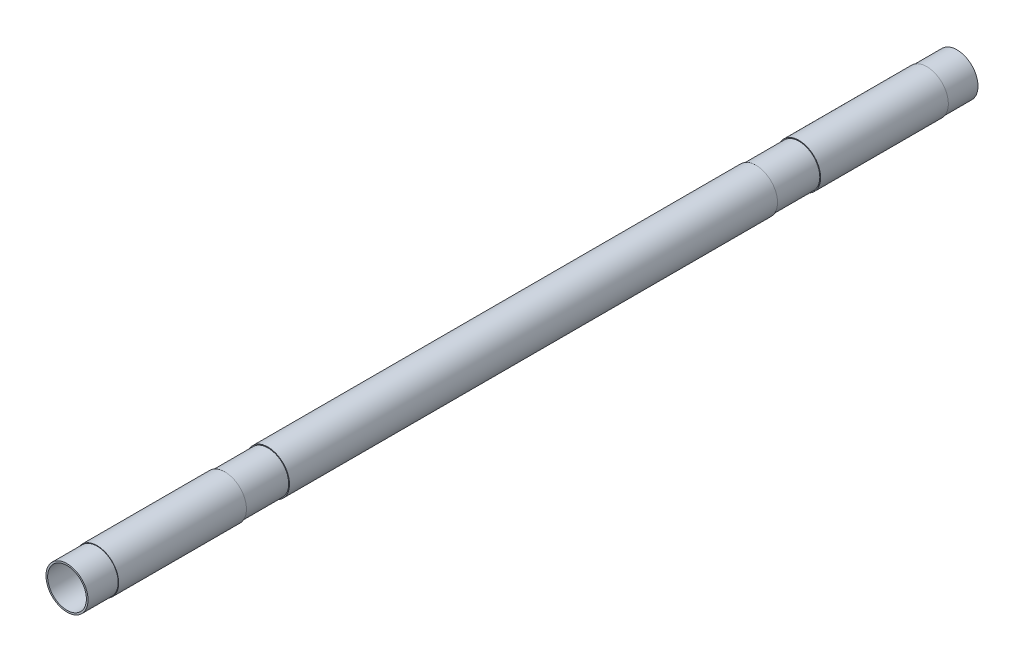
ISO-10303-21;
HEADER;
FILE_DESCRIPTION(('STEP AP214'),'2;1');
FILE_NAME('part.step','',(''),(''),'','','');
FILE_SCHEMA(('AUTOMOTIVE_DESIGN { 1 0 10303 214 1 1 1 1 }'));
ENDSEC;
DATA;
#1=APPLICATION_CONTEXT('core data for automotive mechanical design processes');
#2=APPLICATION_PROTOCOL_DEFINITION('international standard','automotive_design',2000,#1);
#3=PRODUCT_CONTEXT('',#1,'mechanical');
#4=PRODUCT('Part','Part','',(#3));
#5=PRODUCT_RELATED_PRODUCT_CATEGORY('part','',(#4));
#6=PRODUCT_DEFINITION_FORMATION('','',#4);
#7=PRODUCT_DEFINITION_CONTEXT('part definition',#1,'design');
#8=PRODUCT_DEFINITION('design','',#6,#7);
#9=PRODUCT_DEFINITION_SHAPE('','',#8);
#10=(LENGTH_UNIT() NAMED_UNIT(*) SI_UNIT(.MILLI.,.METRE.));
#11=(NAMED_UNIT(*) PLANE_ANGLE_UNIT() SI_UNIT($,.RADIAN.));
#12=(NAMED_UNIT(*) SI_UNIT($,.STERADIAN.) SOLID_ANGLE_UNIT());
#13=UNCERTAINTY_MEASURE_WITH_UNIT(LENGTH_MEASURE(1.E-05),#10,'distance_accuracy_value','');
#14=(GEOMETRIC_REPRESENTATION_CONTEXT(3) GLOBAL_UNCERTAINTY_ASSIGNED_CONTEXT((#13)) GLOBAL_UNIT_ASSIGNED_CONTEXT((#10,
#11,#12)) REPRESENTATION_CONTEXT('',''));
#15=CARTESIAN_POINT('',(0.,0.,0.));
#16=DIRECTION('',(0.,0.,1.));
#17=DIRECTION('',(1.,0.,0.));
#18=AXIS2_PLACEMENT_3D('',#15,#16,#17);
#19=CARTESIAN_POINT('',(0.,0.,620.));
#20=DIRECTION('',(0.,0.,-1.));
#21=DIRECTION('',(-1.,0.,0.));
#22=AXIS2_PLACEMENT_3D('',#19,#20,#21);
#23=CYLINDRICAL_SURFACE('',#22,15.);
#24=CARTESIAN_POINT('',(0.,0.,110.));
#25=DIRECTION('',(0.,0.,-1.));
#26=DIRECTION('',(-1.,0.,0.));
#27=AXIS2_PLACEMENT_3D('',#24,#25,#26);
#28=CIRCLE('',#27,15.);
#29=CARTESIAN_POINT('',(-15.,0.,110.));
#30=VERTEX_POINT('',#29);
#31=EDGE_CURVE('E71',#30,#30,#28,.T.);
#32=ORIENTED_EDGE('',*,*,#31,.T.);
#33=EDGE_LOOP('',(#32));
#34=FACE_BOUND('',#33,.T.);
#35=CARTESIAN_POINT('',(0.,0.,21.));
#36=DIRECTION('',(0.,0.,-1.));
#37=DIRECTION('',(-1.,0.,0.));
#38=AXIS2_PLACEMENT_3D('',#35,#36,#37);
#39=CIRCLE('',#38,15.);
#40=CARTESIAN_POINT('',(-15.,0.,21.));
#41=VERTEX_POINT('',#40);
#42=EDGE_CURVE('E46',#41,#41,#39,.T.);
#43=ORIENTED_EDGE('',*,*,#42,.F.);
#44=EDGE_LOOP('',(#43));
#45=FACE_BOUND('',#44,.T.);
#46=ADVANCED_FACE('F42',(#34,#45),#23,.T.);
#47=CARTESIAN_POINT('',(0.,0.,0.));
#48=DIRECTION('',(0.,0.,1.));
#49=DIRECTION('',(1.,0.,0.));
#50=AXIS2_PLACEMENT_3D('',#47,#48,#49);
#51=PLANE('',#50);
#52=CARTESIAN_POINT('',(0.,0.,0.));
#53=DIRECTION('',(0.,0.,-1.));
#54=DIRECTION('',(-1.,0.,0.));
#55=AXIS2_PLACEMENT_3D('',#52,#53,#54);
#56=CIRCLE('',#55,13.5);
#57=CARTESIAN_POINT('',(-13.5,0.,0.));
#58=VERTEX_POINT('',#57);
#59=EDGE_CURVE('E50',#58,#58,#56,.T.);
#60=ORIENTED_EDGE('',*,*,#59,.F.);
#61=EDGE_LOOP('',(#60));
#62=FACE_BOUND('',#61,.T.);
#63=CARTESIAN_POINT('',(0.,0.,0.));
#64=DIRECTION('',(0.,0.,1.));
#65=DIRECTION('',(1.,0.,0.));
#66=AXIS2_PLACEMENT_3D('',#63,#64,#65);
#67=CIRCLE('',#66,14.662495412805);
#68=CARTESIAN_POINT('',(14.662495412805,0.,0.));
#69=VERTEX_POINT('',#68);
#70=EDGE_CURVE('E90',#69,#69,#67,.T.);
#71=ORIENTED_EDGE('',*,*,#70,.F.);
#72=EDGE_LOOP('',(#71));
#73=FACE_BOUND('',#72,.T.);
#74=ADVANCED_FACE('F133',(#62,#73),#51,.F.);
#75=CARTESIAN_POINT('',(0.,0.,510.));
#76=DIRECTION('',(0.,0.,1.));
#77=DIRECTION('',(1.,0.,0.));
#78=AXIS2_PLACEMENT_3D('',#75,#76,#77);
#79=CIRCLE('',#78,15.);
#80=CARTESIAN_POINT('',(15.,0.,510.));
#81=VERTEX_POINT('',#80);
#82=EDGE_CURVE('E55',#81,#81,#79,.T.);
#83=ORIENTED_EDGE('',*,*,#82,.T.);
#84=EDGE_LOOP('',(#83));
#85=FACE_BOUND('',#84,.T.);
#86=CARTESIAN_POINT('',(0.,0.,599.));
#87=DIRECTION('',(0.,0.,1.));
#88=DIRECTION('',(1.,0.,0.));
#89=AXIS2_PLACEMENT_3D('',#86,#87,#88);
#90=CIRCLE('',#89,15.);
#91=CARTESIAN_POINT('',(15.,0.,599.));
#92=VERTEX_POINT('',#91);
#93=EDGE_CURVE('E74',#92,#92,#90,.T.);
#94=ORIENTED_EDGE('',*,*,#93,.F.);
#95=EDGE_LOOP('',(#94));
#96=FACE_BOUND('',#95,.T.);
#97=ADVANCED_FACE('F44',(#85,#96),#23,.T.);
#98=CARTESIAN_POINT('',(0.,0.,620.));
#99=DIRECTION('',(0.,0.,1.));
#100=DIRECTION('',(1.,0.,0.));
#101=AXIS2_PLACEMENT_3D('',#98,#99,#100);
#102=PLANE('',#101);
#103=CARTESIAN_POINT('',(0.,0.,620.));
#104=DIRECTION('',(0.,0.,-1.));
#105=DIRECTION('',(-1.,0.,0.));
#106=AXIS2_PLACEMENT_3D('',#103,#104,#105);
#107=CIRCLE('',#106,13.5);
#108=CARTESIAN_POINT('',(-13.5,0.,620.));
#109=VERTEX_POINT('',#108);
#110=EDGE_CURVE('E11',#109,#109,#107,.T.);
#111=ORIENTED_EDGE('',*,*,#110,.T.);
#112=EDGE_LOOP('',(#111));
#113=FACE_BOUND('',#112,.T.);
#114=CARTESIAN_POINT('',(0.,0.,620.));
#115=DIRECTION('',(0.,0.,1.));
#116=DIRECTION('',(1.,0.,0.));
#117=AXIS2_PLACEMENT_3D('',#114,#115,#116);
#118=CIRCLE('',#117,14.662495412805);
#119=CARTESIAN_POINT('',(14.662495412805,0.,620.));
#120=VERTEX_POINT('',#119);
#121=EDGE_CURVE('E83',#120,#120,#118,.T.);
#122=ORIENTED_EDGE('',*,*,#121,.T.);
#123=EDGE_LOOP('',(#122));
#124=FACE_BOUND('',#123,.T.);
#125=ADVANCED_FACE('F113',(#113,#124),#102,.T.);
#126=CARTESIAN_POINT('',(0.,0.,480.));
#127=DIRECTION('',(0.,0.,1.));
#128=DIRECTION('',(1.,0.,0.));
#129=AXIS2_PLACEMENT_3D('',#126,#127,#128);
#130=CIRCLE('',#129,15.);
#131=CARTESIAN_POINT('',(15.,0.,480.));
#132=VERTEX_POINT('',#131);
#133=EDGE_CURVE('E61',#132,#132,#130,.T.);
#134=ORIENTED_EDGE('',*,*,#133,.F.);
#135=EDGE_LOOP('',(#134));
#136=FACE_BOUND('',#135,.T.);
#137=CARTESIAN_POINT('',(0.,0.,140.));
#138=DIRECTION('',(0.,0.,-1.));
#139=DIRECTION('',(-1.,0.,0.));
#140=AXIS2_PLACEMENT_3D('',#137,#138,#139);
#141=CIRCLE('',#140,15.);
#142=CARTESIAN_POINT('',(-15.,0.,140.));
#143=VERTEX_POINT('',#142);
#144=EDGE_CURVE('E66',#143,#143,#141,.T.);
#145=ORIENTED_EDGE('',*,*,#144,.F.);
#146=EDGE_LOOP('',(#145));
#147=FACE_BOUND('',#146,.T.);
#148=ADVANCED_FACE('F109',(#136,#147),#23,.T.);
#149=CARTESIAN_POINT('',(0.,0.,620.));
#150=DIRECTION('',(0.,0.,-1.));
#151=DIRECTION('',(-1.,0.,0.));
#152=AXIS2_PLACEMENT_3D('',#149,#150,#151);
#153=CYLINDRICAL_SURFACE('',#152,13.5);
#154=ORIENTED_EDGE('',*,*,#110,.F.);
#155=EDGE_LOOP('',(#154));
#156=FACE_BOUND('',#155,.T.);
#157=ORIENTED_EDGE('',*,*,#59,.T.);
#158=EDGE_LOOP('',(#157));
#159=FACE_BOUND('',#158,.T.);
#160=ADVANCED_FACE('F112',(#156,#159),#153,.F.);
#161=CARTESIAN_POINT('',(0.,0.,510.));
#162=DIRECTION('',(0.,0.,1.));
#163=DIRECTION('',(1.,0.,0.));
#164=AXIS2_PLACEMENT_3D('',#161,#162,#163);
#165=PLANE('',#164);
#166=CARTESIAN_POINT('',(0.,0.,510.));
#167=DIRECTION('',(0.,0.,1.));
#168=DIRECTION('',(1.,0.,0.));
#169=AXIS2_PLACEMENT_3D('',#166,#167,#168);
#170=CIRCLE('',#169,14.4478433260719);
#171=CARTESIAN_POINT('',(14.4478433260719,0.,510.));
#172=VERTEX_POINT('',#171);
#173=EDGE_CURVE('E64',#172,#172,#170,.T.);
#174=ORIENTED_EDGE('',*,*,#173,.T.);
#175=EDGE_LOOP('',(#174));
#176=FACE_BOUND('',#175,.T.);
#177=ORIENTED_EDGE('',*,*,#82,.F.);
#178=EDGE_LOOP('',(#177));
#179=FACE_BOUND('',#178,.T.);
#180=ADVANCED_FACE('F105',(#176,#179),#165,.F.);
#181=CARTESIAN_POINT('',(0.,0.,480.));
#182=DIRECTION('',(0.,0.,1.));
#183=DIRECTION('',(1.,0.,0.));
#184=AXIS2_PLACEMENT_3D('',#181,#182,#183);
#185=PLANE('',#184);
#186=CARTESIAN_POINT('',(0.,0.,480.));
#187=DIRECTION('',(0.,0.,1.));
#188=DIRECTION('',(1.,0.,0.));
#189=AXIS2_PLACEMENT_3D('',#186,#187,#188);
#190=CIRCLE('',#189,14.4478433260719);
#191=CARTESIAN_POINT('',(14.4478433260719,0.,480.));
#192=VERTEX_POINT('',#191);
#193=EDGE_CURVE('E58',#192,#192,#190,.T.);
#194=ORIENTED_EDGE('',*,*,#193,.F.);
#195=EDGE_LOOP('',(#194));
#196=FACE_BOUND('',#195,.T.);
#197=ORIENTED_EDGE('',*,*,#133,.T.);
#198=EDGE_LOOP('',(#197));
#199=FACE_BOUND('',#198,.T.);
#200=ADVANCED_FACE('F102',(#196,#199),#185,.T.);
#201=CARTESIAN_POINT('',(0.,0.,510.));
#202=DIRECTION('',(0.,0.,-1.));
#203=DIRECTION('',(-1.,0.,0.));
#204=AXIS2_PLACEMENT_3D('',#201,#202,#203);
#205=CYLINDRICAL_SURFACE('',#204,14.4478433260719);
#206=ORIENTED_EDGE('',*,*,#173,.F.);
#207=EDGE_LOOP('',(#206));
#208=FACE_BOUND('',#207,.T.);
#209=ORIENTED_EDGE('',*,*,#193,.T.);
#210=EDGE_LOOP('',(#209));
#211=FACE_BOUND('',#210,.T.);
#212=ADVANCED_FACE('F100',(#208,#211),#205,.T.);
#213=CARTESIAN_POINT('',(0.,0.,110.));
#214=DIRECTION('',(0.,0.,-1.));
#215=DIRECTION('',(1.,0.,0.));
#216=AXIS2_PLACEMENT_3D('',#213,#214,#215);
#217=PLANE('',#216);
#218=CARTESIAN_POINT('',(0.,0.,110.));
#219=DIRECTION('',(0.,0.,1.));
#220=DIRECTION('',(1.,0.,0.));
#221=AXIS2_PLACEMENT_3D('',#218,#219,#220);
#222=CIRCLE('',#221,14.4478433260719);
#223=CARTESIAN_POINT('',(14.4478433260719,0.,110.));
#224=VERTEX_POINT('',#223);
#225=EDGE_CURVE('E72',#224,#224,#222,.T.);
#226=ORIENTED_EDGE('',*,*,#225,.F.);
#227=EDGE_LOOP('',(#226));
#228=FACE_BOUND('',#227,.T.);
#229=ORIENTED_EDGE('',*,*,#31,.F.);
#230=EDGE_LOOP('',(#229));
#231=FACE_BOUND('',#230,.T.);
#232=ADVANCED_FACE('F119',(#228,#231),#217,.F.);
#233=CARTESIAN_POINT('',(0.,0.,140.));
#234=DIRECTION('',(0.,0.,-1.));
#235=DIRECTION('',(1.,0.,0.));
#236=AXIS2_PLACEMENT_3D('',#233,#234,#235);
#237=PLANE('',#236);
#238=CARTESIAN_POINT('',(0.,0.,140.));
#239=DIRECTION('',(0.,0.,1.));
#240=DIRECTION('',(1.,0.,0.));
#241=AXIS2_PLACEMENT_3D('',#238,#239,#240);
#242=CIRCLE('',#241,14.4478433260719);
#243=CARTESIAN_POINT('',(14.4478433260719,0.,140.));
#244=VERTEX_POINT('',#243);
#245=EDGE_CURVE('E76',#244,#244,#242,.T.);
#246=ORIENTED_EDGE('',*,*,#245,.T.);
#247=EDGE_LOOP('',(#246));
#248=FACE_BOUND('',#247,.T.);
#249=ORIENTED_EDGE('',*,*,#144,.T.);
#250=EDGE_LOOP('',(#249));
#251=FACE_BOUND('',#250,.T.);
#252=ADVANCED_FACE('F116',(#248,#251),#237,.T.);
#253=CARTESIAN_POINT('',(0.,0.,110.));
#254=DIRECTION('',(0.,0.,1.));
#255=DIRECTION('',(1.,0.,0.));
#256=AXIS2_PLACEMENT_3D('',#253,#254,#255);
#257=CYLINDRICAL_SURFACE('',#256,14.4478433260719);
#258=ORIENTED_EDGE('',*,*,#225,.T.);
#259=EDGE_LOOP('',(#258));
#260=FACE_BOUND('',#259,.T.);
#261=ORIENTED_EDGE('',*,*,#245,.F.);
#262=EDGE_LOOP('',(#261));
#263=FACE_BOUND('',#262,.T.);
#264=ADVANCED_FACE('F118',(#260,#263),#257,.T.);
#265=CARTESIAN_POINT('',(0.,0.,599.));
#266=DIRECTION('',(0.,0.,1.));
#267=DIRECTION('',(1.,0.,0.));
#268=AXIS2_PLACEMENT_3D('',#265,#266,#267);
#269=PLANE('',#268);
#270=CARTESIAN_POINT('',(0.,0.,599.));
#271=DIRECTION('',(0.,0.,1.));
#272=DIRECTION('',(1.,0.,0.));
#273=AXIS2_PLACEMENT_3D('',#270,#271,#272);
#274=CIRCLE('',#273,14.662495412805);
#275=CARTESIAN_POINT('',(14.662495412805,0.,599.));
#276=VERTEX_POINT('',#275);
#277=EDGE_CURVE('E77',#276,#276,#274,.T.);
#278=ORIENTED_EDGE('',*,*,#277,.F.);
#279=EDGE_LOOP('',(#278));
#280=FACE_BOUND('',#279,.T.);
#281=ORIENTED_EDGE('',*,*,#93,.T.);
#282=EDGE_LOOP('',(#281));
#283=FACE_BOUND('',#282,.T.);
#284=ADVANCED_FACE('F126',(#280,#283),#269,.T.);
#285=CARTESIAN_POINT('',(0.,0.,599.));
#286=DIRECTION('',(0.,0.,1.));
#287=DIRECTION('',(1.,0.,0.));
#288=AXIS2_PLACEMENT_3D('',#285,#286,#287);
#289=CYLINDRICAL_SURFACE('',#288,14.662495412805);
#290=ORIENTED_EDGE('',*,*,#277,.T.);
#291=EDGE_LOOP('',(#290));
#292=FACE_BOUND('',#291,.T.);
#293=ORIENTED_EDGE('',*,*,#121,.F.);
#294=EDGE_LOOP('',(#293));
#295=FACE_BOUND('',#294,.T.);
#296=ADVANCED_FACE('F189',(#292,#295),#289,.T.);
#297=CARTESIAN_POINT('',(0.,0.,21.));
#298=DIRECTION('',(0.,0.,-1.));
#299=DIRECTION('',(1.,0.,0.));
#300=AXIS2_PLACEMENT_3D('',#297,#298,#299);
#301=PLANE('',#300);
#302=CARTESIAN_POINT('',(0.,0.,21.));
#303=DIRECTION('',(0.,0.,1.));
#304=DIRECTION('',(1.,0.,0.));
#305=AXIS2_PLACEMENT_3D('',#302,#303,#304);
#306=CIRCLE('',#305,14.662495412805);
#307=CARTESIAN_POINT('',(14.662495412805,0.,21.));
#308=VERTEX_POINT('',#307);
#309=EDGE_CURVE('E292',#308,#308,#306,.T.);
#310=ORIENTED_EDGE('',*,*,#309,.T.);
#311=EDGE_LOOP('',(#310));
#312=FACE_BOUND('',#311,.T.);
#313=ORIENTED_EDGE('',*,*,#42,.T.);
#314=EDGE_LOOP('',(#313));
#315=FACE_BOUND('',#314,.T.);
#316=ADVANCED_FACE('F180',(#312,#315),#301,.T.);
#317=CARTESIAN_POINT('',(0.,0.,21.));
#318=DIRECTION('',(0.,0.,-1.));
#319=DIRECTION('',(-1.,0.,0.));
#320=AXIS2_PLACEMENT_3D('',#317,#318,#319);
#321=CYLINDRICAL_SURFACE('',#320,14.662495412805);
#322=ORIENTED_EDGE('',*,*,#309,.F.);
#323=EDGE_LOOP('',(#322));
#324=FACE_BOUND('',#323,.T.);
#325=ORIENTED_EDGE('',*,*,#70,.T.);
#326=EDGE_LOOP('',(#325));
#327=FACE_BOUND('',#326,.T.);
#328=ADVANCED_FACE('F175',(#324,#327),#321,.T.);
#329=CLOSED_SHELL('',(#46,#74,#97,#125,#148,#160,#180,#200,#212,#232,#252,#264,#284,#296,#316,#328));
#330=MANIFOLD_SOLID_BREP('B2',#329);
#331=ADVANCED_BREP_SHAPE_REPRESENTATION('',(#18,#330),#14);
#332=SHAPE_DEFINITION_REPRESENTATION(#9,#331);
ENDSEC;
END-ISO-10303-21;
